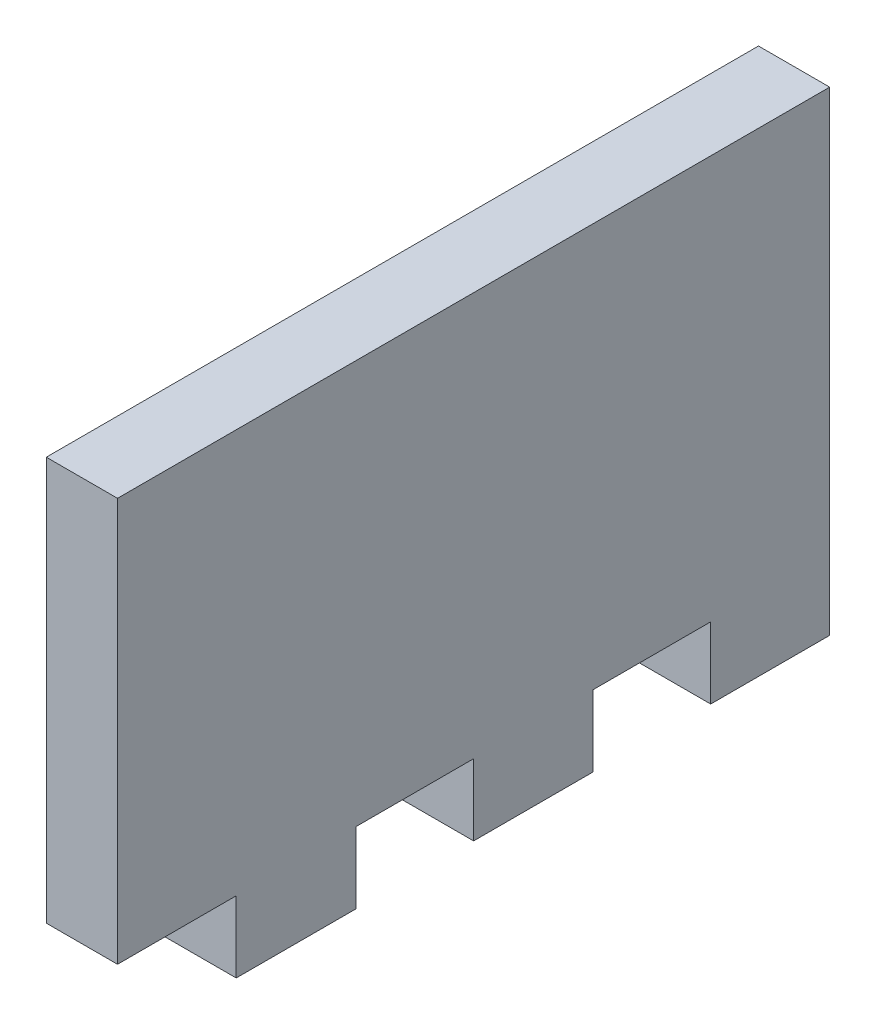
ISO-10303-21;
HEADER;
FILE_DESCRIPTION(('STEP AP214'),'2;1');
FILE_NAME('part.step','',(''),(''),'','','');
FILE_SCHEMA(('AUTOMOTIVE_DESIGN { 1 0 10303 214 1 1 1 1 }'));
ENDSEC;
DATA;
#1=APPLICATION_CONTEXT('core data for automotive mechanical design processes');
#2=APPLICATION_PROTOCOL_DEFINITION('international standard','automotive_design',2000,#1);
#3=PRODUCT_CONTEXT('',#1,'mechanical');
#4=PRODUCT('Part','Part','',(#3));
#5=PRODUCT_RELATED_PRODUCT_CATEGORY('part','',(#4));
#6=PRODUCT_DEFINITION_FORMATION('','',#4);
#7=PRODUCT_DEFINITION_CONTEXT('part definition',#1,'design');
#8=PRODUCT_DEFINITION('design','',#6,#7);
#9=PRODUCT_DEFINITION_SHAPE('','',#8);
#10=(LENGTH_UNIT() NAMED_UNIT(*) SI_UNIT(.MILLI.,.METRE.));
#11=(NAMED_UNIT(*) PLANE_ANGLE_UNIT() SI_UNIT($,.RADIAN.));
#12=(NAMED_UNIT(*) SI_UNIT($,.STERADIAN.) SOLID_ANGLE_UNIT());
#13=UNCERTAINTY_MEASURE_WITH_UNIT(LENGTH_MEASURE(1.E-05),#10,'distance_accuracy_value','');
#14=(GEOMETRIC_REPRESENTATION_CONTEXT(3) GLOBAL_UNCERTAINTY_ASSIGNED_CONTEXT((#13)) GLOBAL_UNIT_ASSIGNED_CONTEXT((#10,
#11,#12)) REPRESENTATION_CONTEXT('',''));
#15=CARTESIAN_POINT('',(0.,0.,0.));
#16=DIRECTION('',(0.,0.,1.));
#17=DIRECTION('',(1.,0.,0.));
#18=AXIS2_PLACEMENT_3D('',#15,#16,#17);
#19=CARTESIAN_POINT('',(3.,0.,0.));
#20=DIRECTION('',(0.,0.,1.));
#21=DIRECTION('',(1.,0.,0.));
#22=AXIS2_PLACEMENT_3D('',#19,#20,#21);
#23=PLANE('',#22);
#24=DIRECTION('',(0.,1.,0.));
#25=VECTOR('',#24,1.);
#26=CARTESIAN_POINT('',(0.,0.,0.));
#27=LINE('',#26,#25);
#28=CARTESIAN_POINT('',(0.,3.,0.));
#29=VERTEX_POINT('',#28);
#30=CARTESIAN_POINT('',(0.,20.,0.));
#31=VERTEX_POINT('',#30);
#32=EDGE_CURVE('E192',#29,#31,#27,.T.);
#33=ORIENTED_EDGE('',*,*,#32,.F.);
#34=DIRECTION('',(1.,0.,0.));
#35=VECTOR('',#34,1.);
#36=CARTESIAN_POINT('',(0.,3.,0.));
#37=LINE('',#36,#35);
#38=CARTESIAN_POINT('',(3.,3.,0.));
#39=VERTEX_POINT('',#38);
#40=EDGE_CURVE('E217',#29,#39,#37,.T.);
#41=ORIENTED_EDGE('',*,*,#40,.T.);
#42=DIRECTION('',(0.,1.,0.));
#43=VECTOR('',#42,1.);
#44=CARTESIAN_POINT('',(3.,0.,0.));
#45=LINE('',#44,#43);
#46=CARTESIAN_POINT('',(3.,20.,0.));
#47=VERTEX_POINT('',#46);
#48=EDGE_CURVE('E220',#39,#47,#45,.T.);
#49=ORIENTED_EDGE('',*,*,#48,.T.);
#50=DIRECTION('',(-1.,0.,0.));
#51=VECTOR('',#50,1.);
#52=CARTESIAN_POINT('',(3.,20.,0.));
#53=LINE('',#52,#51);
#54=EDGE_CURVE('E12',#47,#31,#53,.T.);
#55=ORIENTED_EDGE('',*,*,#54,.T.);
#56=EDGE_LOOP('',(#33,#41,#49,#55));
#57=FACE_BOUND('',#56,.T.);
#58=ADVANCED_FACE('F63',(#57),#23,.T.);
#59=CARTESIAN_POINT('',(3.,0.,0.));
#60=DIRECTION('',(0.,1.,0.));
#61=DIRECTION('',(0.,0.,1.));
#62=AXIS2_PLACEMENT_3D('',#59,#60,#61);
#63=PLANE('',#62);
#64=DIRECTION('',(0.,0.,-1.));
#65=VECTOR('',#64,1.);
#66=CARTESIAN_POINT('',(3.,0.,0.));
#67=LINE('',#66,#65);
#68=CARTESIAN_POINT('',(3.,0.,-5.));
#69=VERTEX_POINT('',#68);
#70=CARTESIAN_POINT('',(3.,0.,-10.0397033502183));
#71=VERTEX_POINT('',#70);
#72=EDGE_CURVE('E184',#69,#71,#67,.T.);
#73=ORIENTED_EDGE('',*,*,#72,.F.);
#74=DIRECTION('',(1.,0.,0.));
#75=VECTOR('',#74,1.);
#76=CARTESIAN_POINT('',(0.,0.,-5.));
#77=LINE('',#76,#75);
#78=CARTESIAN_POINT('',(0.,0.,-5.));
#79=VERTEX_POINT('',#78);
#80=EDGE_CURVE('E168',#79,#69,#77,.T.);
#81=ORIENTED_EDGE('',*,*,#80,.F.);
#82=DIRECTION('',(0.,0.,-1.));
#83=VECTOR('',#82,1.);
#84=CARTESIAN_POINT('',(0.,0.,0.));
#85=LINE('',#84,#83);
#86=CARTESIAN_POINT('',(0.,0.,-10.0397033502183));
#87=VERTEX_POINT('',#86);
#88=EDGE_CURVE('E182',#79,#87,#85,.T.);
#89=ORIENTED_EDGE('',*,*,#88,.T.);
#90=DIRECTION('',(1.,0.,0.));
#91=VECTOR('',#90,1.);
#92=CARTESIAN_POINT('',(0.,0.,-10.0397033502183));
#93=LINE('',#92,#91);
#94=EDGE_CURVE('E250',#87,#71,#93,.T.);
#95=ORIENTED_EDGE('',*,*,#94,.T.);
#96=EDGE_LOOP('',(#73,#81,#89,#95));
#97=FACE_BOUND('',#96,.T.);
#98=ADVANCED_FACE('F180',(#97),#63,.F.);
#99=CARTESIAN_POINT('',(3.,0.,-15.));
#100=VERTEX_POINT('',#99);
#101=CARTESIAN_POINT('',(3.,0.,-20.0354668597429));
#102=VERTEX_POINT('',#101);
#103=EDGE_CURVE('E226',#100,#102,#67,.T.);
#104=ORIENTED_EDGE('',*,*,#103,.F.);
#105=DIRECTION('',(1.,0.,0.));
#106=VECTOR('',#105,1.);
#107=CARTESIAN_POINT('',(0.,0.,-15.));
#108=LINE('',#107,#106);
#109=CARTESIAN_POINT('',(0.,0.,-15.));
#110=VERTEX_POINT('',#109);
#111=EDGE_CURVE('E280',#110,#100,#108,.T.);
#112=ORIENTED_EDGE('',*,*,#111,.F.);
#113=CARTESIAN_POINT('',(0.,0.,-20.0354668597429));
#114=VERTEX_POINT('',#113);
#115=EDGE_CURVE('E193',#110,#114,#85,.T.);
#116=ORIENTED_EDGE('',*,*,#115,.T.);
#117=DIRECTION('',(1.,0.,0.));
#118=VECTOR('',#117,1.);
#119=CARTESIAN_POINT('',(0.,0.,-20.0354668597429));
#120=LINE('',#119,#118);
#121=EDGE_CURVE('E258',#114,#102,#120,.T.);
#122=ORIENTED_EDGE('',*,*,#121,.T.);
#123=EDGE_LOOP('',(#104,#112,#116,#122));
#124=FACE_BOUND('',#123,.T.);
#125=ADVANCED_FACE('F342',(#124),#63,.F.);
#126=CARTESIAN_POINT('',(3.,0.,0.));
#127=DIRECTION('',(1.,0.,0.));
#128=DIRECTION('',(0.,0.,-1.));
#129=AXIS2_PLACEMENT_3D('',#126,#127,#128);
#130=PLANE('',#129);
#131=ORIENTED_EDGE('',*,*,#48,.F.);
#132=DIRECTION('',(0.,0.,-1.));
#133=VECTOR('',#132,1.);
#134=CARTESIAN_POINT('',(3.,3.,0.));
#135=LINE('',#134,#133);
#136=CARTESIAN_POINT('',(3.,3.,-5.));
#137=VERTEX_POINT('',#136);
#138=EDGE_CURVE('E175',#39,#137,#135,.T.);
#139=ORIENTED_EDGE('',*,*,#138,.T.);
#140=DIRECTION('',(0.,1.,0.));
#141=VECTOR('',#140,1.);
#142=CARTESIAN_POINT('',(3.,0.,-5.));
#143=LINE('',#142,#141);
#144=EDGE_CURVE('E284',#69,#137,#143,.T.);
#145=ORIENTED_EDGE('',*,*,#144,.F.);
#146=ORIENTED_EDGE('',*,*,#72,.T.);
#147=DIRECTION('',(0.,1.,0.));
#148=VECTOR('',#147,1.);
#149=CARTESIAN_POINT('',(3.,0.,-10.0397033502183));
#150=LINE('',#149,#148);
#151=CARTESIAN_POINT('',(3.,3.,-10.0397033502183));
#152=VERTEX_POINT('',#151);
#153=EDGE_CURVE('E274',#71,#152,#150,.T.);
#154=ORIENTED_EDGE('',*,*,#153,.T.);
#155=DIRECTION('',(0.,0.,-1.));
#156=VECTOR('',#155,1.);
#157=CARTESIAN_POINT('',(3.,3.,0.));
#158=LINE('',#157,#156);
#159=CARTESIAN_POINT('',(3.,3.,-15.));
#160=VERTEX_POINT('',#159);
#161=EDGE_CURVE('E285',#152,#160,#158,.T.);
#162=ORIENTED_EDGE('',*,*,#161,.T.);
#163=DIRECTION('',(0.,1.,0.));
#164=VECTOR('',#163,1.);
#165=CARTESIAN_POINT('',(3.,0.,-15.));
#166=LINE('',#165,#164);
#167=EDGE_CURVE('E281',#100,#160,#166,.T.);
#168=ORIENTED_EDGE('',*,*,#167,.F.);
#169=ORIENTED_EDGE('',*,*,#103,.T.);
#170=DIRECTION('',(0.,1.,0.));
#171=VECTOR('',#170,1.);
#172=CARTESIAN_POINT('',(3.,0.,-20.0354668597429));
#173=LINE('',#172,#171);
#174=CARTESIAN_POINT('',(3.,3.,-20.0354668597429));
#175=VERTEX_POINT('',#174);
#176=EDGE_CURVE('E237',#102,#175,#173,.T.);
#177=ORIENTED_EDGE('',*,*,#176,.T.);
#178=DIRECTION('',(0.,0.,-1.));
#179=VECTOR('',#178,1.);
#180=CARTESIAN_POINT('',(3.,3.,0.));
#181=LINE('',#180,#179);
#182=CARTESIAN_POINT('',(3.,3.,-24.987055380726));
#183=VERTEX_POINT('',#182);
#184=EDGE_CURVE('E251',#175,#183,#181,.T.);
#185=ORIENTED_EDGE('',*,*,#184,.T.);
#186=DIRECTION('',(0.,1.,0.));
#187=VECTOR('',#186,1.);
#188=CARTESIAN_POINT('',(3.,0.,-24.987055380726));
#189=LINE('',#188,#187);
#190=CARTESIAN_POINT('',(3.,0.,-24.987055380726));
#191=VERTEX_POINT('',#190);
#192=EDGE_CURVE('E246',#191,#183,#189,.T.);
#193=ORIENTED_EDGE('',*,*,#192,.F.);
#194=CARTESIAN_POINT('',(3.,0.,-30.));
#195=VERTEX_POINT('',#194);
#196=EDGE_CURVE('E223',#191,#195,#67,.T.);
#197=ORIENTED_EDGE('',*,*,#196,.T.);
#198=DIRECTION('',(0.,1.,0.));
#199=VECTOR('',#198,1.);
#200=CARTESIAN_POINT('',(3.,0.,-30.));
#201=LINE('',#200,#199);
#202=CARTESIAN_POINT('',(3.,20.,-30.));
#203=VERTEX_POINT('',#202);
#204=EDGE_CURVE('E227',#195,#203,#201,.T.);
#205=ORIENTED_EDGE('',*,*,#204,.T.);
#206=DIRECTION('',(0.,0.,-1.));
#207=VECTOR('',#206,1.);
#208=CARTESIAN_POINT('',(3.,20.,0.));
#209=LINE('',#208,#207);
#210=EDGE_CURVE('E198',#47,#203,#209,.T.);
#211=ORIENTED_EDGE('',*,*,#210,.F.);
#212=EDGE_LOOP('',(#131,#139,#145,#146,#154,#162,#168,#169,#177,#185,#193,#197,#205,#211));
#213=FACE_BOUND('',#212,.T.);
#214=ADVANCED_FACE('F330',(#213),#130,.T.);
#215=CARTESIAN_POINT('',(0.,0.,0.));
#216=DIRECTION('',(1.,0.,0.));
#217=DIRECTION('',(0.,0.,-1.));
#218=AXIS2_PLACEMENT_3D('',#215,#216,#217);
#219=PLANE('',#218);
#220=DIRECTION('',(0.,0.,-1.));
#221=VECTOR('',#220,1.);
#222=CARTESIAN_POINT('',(0.,3.,0.));
#223=LINE('',#222,#221);
#224=CARTESIAN_POINT('',(0.,3.,-5.));
#225=VERTEX_POINT('',#224);
#226=EDGE_CURVE('E174',#29,#225,#223,.T.);
#227=ORIENTED_EDGE('',*,*,#226,.F.);
#228=ORIENTED_EDGE('',*,*,#32,.T.);
#229=DIRECTION('',(0.,0.,-1.));
#230=VECTOR('',#229,1.);
#231=CARTESIAN_POINT('',(0.,20.,0.));
#232=LINE('',#231,#230);
#233=CARTESIAN_POINT('',(0.,20.,-30.));
#234=VERTEX_POINT('',#233);
#235=EDGE_CURVE('E211',#31,#234,#232,.T.);
#236=ORIENTED_EDGE('',*,*,#235,.T.);
#237=DIRECTION('',(0.,1.,0.));
#238=VECTOR('',#237,1.);
#239=CARTESIAN_POINT('',(0.,0.,-30.));
#240=LINE('',#239,#238);
#241=CARTESIAN_POINT('',(0.,0.,-30.));
#242=VERTEX_POINT('',#241);
#243=EDGE_CURVE('E203',#242,#234,#240,.T.);
#244=ORIENTED_EDGE('',*,*,#243,.F.);
#245=CARTESIAN_POINT('',(0.,0.,-24.987055380726));
#246=VERTEX_POINT('',#245);
#247=EDGE_CURVE('E195',#246,#242,#85,.T.);
#248=ORIENTED_EDGE('',*,*,#247,.F.);
#249=DIRECTION('',(0.,1.,0.));
#250=VECTOR('',#249,1.);
#251=CARTESIAN_POINT('',(0.,0.,-24.987055380726));
#252=LINE('',#251,#250);
#253=CARTESIAN_POINT('',(0.,3.,-24.987055380726));
#254=VERTEX_POINT('',#253);
#255=EDGE_CURVE('E233',#246,#254,#252,.T.);
#256=ORIENTED_EDGE('',*,*,#255,.T.);
#257=DIRECTION('',(0.,0.,-1.));
#258=VECTOR('',#257,1.);
#259=CARTESIAN_POINT('',(0.,3.,0.));
#260=LINE('',#259,#258);
#261=CARTESIAN_POINT('',(0.,3.,-20.0354668597429));
#262=VERTEX_POINT('',#261);
#263=EDGE_CURVE('E238',#262,#254,#260,.T.);
#264=ORIENTED_EDGE('',*,*,#263,.F.);
#265=DIRECTION('',(0.,1.,0.));
#266=VECTOR('',#265,1.);
#267=CARTESIAN_POINT('',(0.,0.,-20.0354668597429));
#268=LINE('',#267,#266);
#269=EDGE_CURVE('E242',#114,#262,#268,.T.);
#270=ORIENTED_EDGE('',*,*,#269,.F.);
#271=ORIENTED_EDGE('',*,*,#115,.F.);
#272=DIRECTION('',(0.,1.,0.));
#273=VECTOR('',#272,1.);
#274=CARTESIAN_POINT('',(0.,0.,-15.));
#275=LINE('',#274,#273);
#276=CARTESIAN_POINT('',(0.,3.,-15.));
#277=VERTEX_POINT('',#276);
#278=EDGE_CURVE('E270',#110,#277,#275,.T.);
#279=ORIENTED_EDGE('',*,*,#278,.T.);
#280=DIRECTION('',(0.,0.,-1.));
#281=VECTOR('',#280,1.);
#282=CARTESIAN_POINT('',(0.,3.,0.));
#283=LINE('',#282,#281);
#284=CARTESIAN_POINT('',(0.,3.,-10.0397033502183));
#285=VERTEX_POINT('',#284);
#286=EDGE_CURVE('E275',#285,#277,#283,.T.);
#287=ORIENTED_EDGE('',*,*,#286,.F.);
#288=DIRECTION('',(0.,1.,0.));
#289=VECTOR('',#288,1.);
#290=CARTESIAN_POINT('',(0.,0.,-10.0397033502183));
#291=LINE('',#290,#289);
#292=EDGE_CURVE('E190',#87,#285,#291,.T.);
#293=ORIENTED_EDGE('',*,*,#292,.F.);
#294=ORIENTED_EDGE('',*,*,#88,.F.);
#295=DIRECTION('',(0.,1.,0.));
#296=VECTOR('',#295,1.);
#297=CARTESIAN_POINT('',(0.,0.,-5.));
#298=LINE('',#297,#296);
#299=EDGE_CURVE('E165',#79,#225,#298,.T.);
#300=ORIENTED_EDGE('',*,*,#299,.T.);
#301=EDGE_LOOP('',(#227,#228,#236,#244,#248,#256,#264,#270,#271,#279,#287,#293,#294,#300));
#302=FACE_BOUND('',#301,.T.);
#303=ADVANCED_FACE('F188',(#302),#219,.F.);
#304=CARTESIAN_POINT('',(3.,20.,0.));
#305=DIRECTION('',(0.,1.,0.));
#306=DIRECTION('',(0.,0.,1.));
#307=AXIS2_PLACEMENT_3D('',#304,#305,#306);
#308=PLANE('',#307);
#309=ORIENTED_EDGE('',*,*,#235,.F.);
#310=ORIENTED_EDGE('',*,*,#54,.F.);
#311=ORIENTED_EDGE('',*,*,#210,.T.);
#312=DIRECTION('',(-1.,0.,0.));
#313=VECTOR('',#312,1.);
#314=CARTESIAN_POINT('',(3.,20.,-30.));
#315=LINE('',#314,#313);
#316=EDGE_CURVE('E67',#203,#234,#315,.T.);
#317=ORIENTED_EDGE('',*,*,#316,.T.);
#318=EDGE_LOOP('',(#309,#310,#311,#317));
#319=FACE_BOUND('',#318,.T.);
#320=ADVANCED_FACE('F65',(#319),#308,.T.);
#321=ORIENTED_EDGE('',*,*,#196,.F.);
#322=DIRECTION('',(1.,0.,0.));
#323=VECTOR('',#322,1.);
#324=CARTESIAN_POINT('',(0.,0.,-24.987055380726));
#325=LINE('',#324,#323);
#326=EDGE_CURVE('E245',#246,#191,#325,.T.);
#327=ORIENTED_EDGE('',*,*,#326,.F.);
#328=ORIENTED_EDGE('',*,*,#247,.T.);
#329=DIRECTION('',(-1.,0.,0.));
#330=VECTOR('',#329,1.);
#331=CARTESIAN_POINT('',(3.,0.,-30.));
#332=LINE('',#331,#330);
#333=EDGE_CURVE('E73',#195,#242,#332,.T.);
#334=ORIENTED_EDGE('',*,*,#333,.F.);
#335=EDGE_LOOP('',(#321,#327,#328,#334));
#336=FACE_BOUND('',#335,.T.);
#337=ADVANCED_FACE('F327',(#336),#63,.F.);
#338=CARTESIAN_POINT('',(3.,0.,-30.));
#339=DIRECTION('',(0.,0.,1.));
#340=DIRECTION('',(1.,0.,0.));
#341=AXIS2_PLACEMENT_3D('',#338,#339,#340);
#342=PLANE('',#341);
#343=ORIENTED_EDGE('',*,*,#243,.T.);
#344=ORIENTED_EDGE('',*,*,#316,.F.);
#345=ORIENTED_EDGE('',*,*,#204,.F.);
#346=ORIENTED_EDGE('',*,*,#333,.T.);
#347=EDGE_LOOP('',(#343,#344,#345,#346));
#348=FACE_BOUND('',#347,.T.);
#349=ADVANCED_FACE('F355',(#348),#342,.F.);
#350=CARTESIAN_POINT('',(0.,0.,-20.0354668597429));
#351=DIRECTION('',(0.,0.,-1.));
#352=DIRECTION('',(-1.,0.,0.));
#353=AXIS2_PLACEMENT_3D('',#350,#351,#352);
#354=PLANE('',#353);
#355=ORIENTED_EDGE('',*,*,#176,.F.);
#356=ORIENTED_EDGE('',*,*,#121,.F.);
#357=ORIENTED_EDGE('',*,*,#269,.T.);
#358=DIRECTION('',(1.,0.,0.));
#359=VECTOR('',#358,1.);
#360=CARTESIAN_POINT('',(0.,3.,-20.0354668597429));
#361=LINE('',#360,#359);
#362=EDGE_CURVE('E262',#262,#175,#361,.T.);
#363=ORIENTED_EDGE('',*,*,#362,.T.);
#364=EDGE_LOOP('',(#355,#356,#357,#363));
#365=FACE_BOUND('',#364,.T.);
#366=ADVANCED_FACE('F337',(#365),#354,.T.);
#367=CARTESIAN_POINT('',(0.,3.,0.));
#368=DIRECTION('',(0.,-1.,0.));
#369=DIRECTION('',(0.,0.,-1.));
#370=AXIS2_PLACEMENT_3D('',#367,#368,#369);
#371=PLANE('',#370);
#372=ORIENTED_EDGE('',*,*,#184,.F.);
#373=ORIENTED_EDGE('',*,*,#362,.F.);
#374=ORIENTED_EDGE('',*,*,#263,.T.);
#375=DIRECTION('',(1.,0.,0.));
#376=VECTOR('',#375,1.);
#377=CARTESIAN_POINT('',(0.,3.,-24.987055380726));
#378=LINE('',#377,#376);
#379=EDGE_CURVE('E265',#254,#183,#378,.T.);
#380=ORIENTED_EDGE('',*,*,#379,.T.);
#381=EDGE_LOOP('',(#372,#373,#374,#380));
#382=FACE_BOUND('',#381,.T.);
#383=ADVANCED_FACE('F335',(#382),#371,.T.);
#384=CARTESIAN_POINT('',(0.,0.,-24.987055380726));
#385=DIRECTION('',(0.,0.,-1.));
#386=DIRECTION('',(-1.,0.,0.));
#387=AXIS2_PLACEMENT_3D('',#384,#385,#386);
#388=PLANE('',#387);
#389=ORIENTED_EDGE('',*,*,#192,.T.);
#390=ORIENTED_EDGE('',*,*,#379,.F.);
#391=ORIENTED_EDGE('',*,*,#255,.F.);
#392=ORIENTED_EDGE('',*,*,#326,.T.);
#393=EDGE_LOOP('',(#389,#390,#391,#392));
#394=FACE_BOUND('',#393,.T.);
#395=ADVANCED_FACE('F324',(#394),#388,.F.);
#396=CARTESIAN_POINT('',(0.,0.,-10.0397033502183));
#397=DIRECTION('',(0.,0.,-1.));
#398=DIRECTION('',(-1.,0.,0.));
#399=AXIS2_PLACEMENT_3D('',#396,#397,#398);
#400=PLANE('',#399);
#401=ORIENTED_EDGE('',*,*,#153,.F.);
#402=ORIENTED_EDGE('',*,*,#94,.F.);
#403=ORIENTED_EDGE('',*,*,#292,.T.);
#404=DIRECTION('',(1.,0.,0.));
#405=VECTOR('',#404,1.);
#406=CARTESIAN_POINT('',(0.,3.,-10.0397033502183));
#407=LINE('',#406,#405);
#408=EDGE_CURVE('E294',#285,#152,#407,.T.);
#409=ORIENTED_EDGE('',*,*,#408,.T.);
#410=EDGE_LOOP('',(#401,#402,#403,#409));
#411=FACE_BOUND('',#410,.T.);
#412=ADVANCED_FACE('F350',(#411),#400,.T.);
#413=CARTESIAN_POINT('',(0.,3.,0.));
#414=DIRECTION('',(0.,-1.,0.));
#415=DIRECTION('',(0.,0.,-1.));
#416=AXIS2_PLACEMENT_3D('',#413,#414,#415);
#417=PLANE('',#416);
#418=ORIENTED_EDGE('',*,*,#161,.F.);
#419=ORIENTED_EDGE('',*,*,#408,.F.);
#420=ORIENTED_EDGE('',*,*,#286,.T.);
#421=DIRECTION('',(1.,0.,0.));
#422=VECTOR('',#421,1.);
#423=CARTESIAN_POINT('',(0.,3.,-15.));
#424=LINE('',#423,#422);
#425=EDGE_CURVE('E89',#277,#160,#424,.T.);
#426=ORIENTED_EDGE('',*,*,#425,.T.);
#427=EDGE_LOOP('',(#418,#419,#420,#426));
#428=FACE_BOUND('',#427,.T.);
#429=ADVANCED_FACE('F348',(#428),#417,.T.);
#430=CARTESIAN_POINT('',(0.,0.,-15.));
#431=DIRECTION('',(0.,0.,-1.));
#432=DIRECTION('',(-1.,0.,0.));
#433=AXIS2_PLACEMENT_3D('',#430,#431,#432);
#434=PLANE('',#433);
#435=ORIENTED_EDGE('',*,*,#167,.T.);
#436=ORIENTED_EDGE('',*,*,#425,.F.);
#437=ORIENTED_EDGE('',*,*,#278,.F.);
#438=ORIENTED_EDGE('',*,*,#111,.T.);
#439=EDGE_LOOP('',(#435,#436,#437,#438));
#440=FACE_BOUND('',#439,.T.);
#441=ADVANCED_FACE('F344',(#440),#434,.F.);
#442=CARTESIAN_POINT('',(0.,3.,0.));
#443=DIRECTION('',(0.,-1.,0.));
#444=DIRECTION('',(0.,0.,-1.));
#445=AXIS2_PLACEMENT_3D('',#442,#443,#444);
#446=PLANE('',#445);
#447=ORIENTED_EDGE('',*,*,#138,.F.);
#448=ORIENTED_EDGE('',*,*,#40,.F.);
#449=ORIENTED_EDGE('',*,*,#226,.T.);
#450=DIRECTION('',(1.,0.,0.));
#451=VECTOR('',#450,1.);
#452=CARTESIAN_POINT('',(0.,3.,-5.));
#453=LINE('',#452,#451);
#454=EDGE_CURVE('E81',#225,#137,#453,.T.);
#455=ORIENTED_EDGE('',*,*,#454,.T.);
#456=EDGE_LOOP('',(#447,#448,#449,#455));
#457=FACE_BOUND('',#456,.T.);
#458=ADVANCED_FACE('F313',(#457),#446,.T.);
#459=CARTESIAN_POINT('',(0.,0.,-5.));
#460=DIRECTION('',(0.,0.,-1.));
#461=DIRECTION('',(0.,1.,0.));
#462=AXIS2_PLACEMENT_3D('',#459,#460,#461);
#463=PLANE('',#462);
#464=ORIENTED_EDGE('',*,*,#144,.T.);
#465=ORIENTED_EDGE('',*,*,#454,.F.);
#466=ORIENTED_EDGE('',*,*,#299,.F.);
#467=ORIENTED_EDGE('',*,*,#80,.T.);
#468=EDGE_LOOP('',(#464,#465,#466,#467));
#469=FACE_BOUND('',#468,.T.);
#470=ADVANCED_FACE('F167',(#469),#463,.F.);
#471=CLOSED_SHELL('',(#58,#98,#125,#214,#303,#320,#337,#349,#366,#383,#395,#412,#429,#441,#458,#470));
#472=MANIFOLD_SOLID_BREP('B2',#471);
#473=ADVANCED_BREP_SHAPE_REPRESENTATION('',(#18,#472),#14);
#474=SHAPE_DEFINITION_REPRESENTATION(#9,#473);
ENDSEC;
END-ISO-10303-21;
